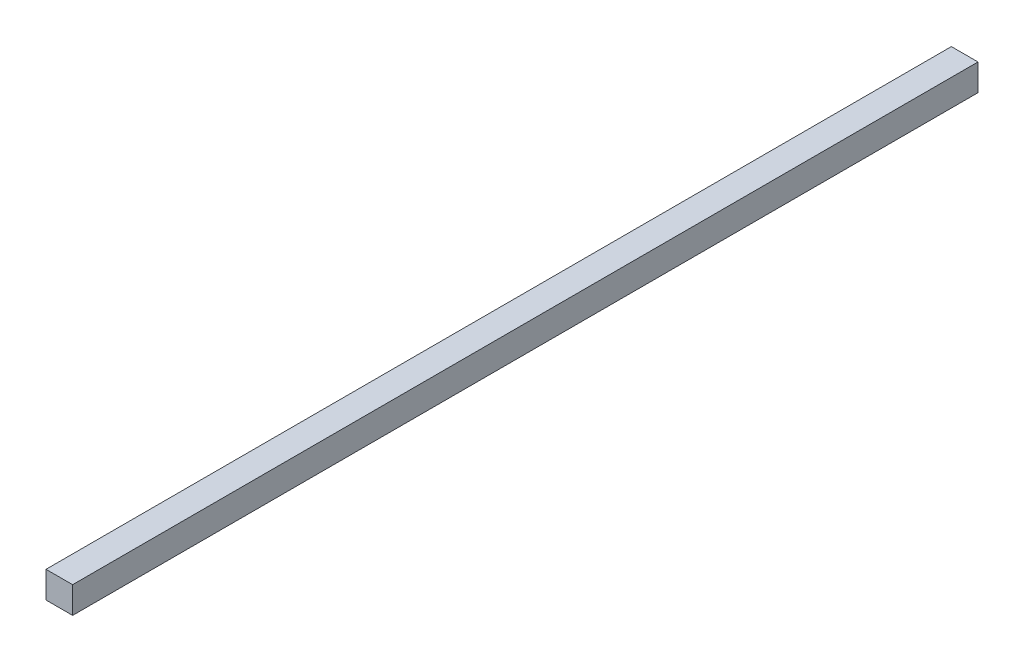
ISO-10303-21;
HEADER;
FILE_DESCRIPTION(('STEP AP214'),'2;1');
FILE_NAME('part.step','',(''),(''),'','','');
FILE_SCHEMA(('AUTOMOTIVE_DESIGN { 1 0 10303 214 1 1 1 1 }'));
ENDSEC;
DATA;
#1=APPLICATION_CONTEXT('core data for automotive mechanical design processes');
#2=APPLICATION_PROTOCOL_DEFINITION('international standard','automotive_design',2000,#1);
#3=PRODUCT_CONTEXT('',#1,'mechanical');
#4=PRODUCT('Part','Part','',(#3));
#5=PRODUCT_RELATED_PRODUCT_CATEGORY('part','',(#4));
#6=PRODUCT_DEFINITION_FORMATION('','',#4);
#7=PRODUCT_DEFINITION_CONTEXT('part definition',#1,'design');
#8=PRODUCT_DEFINITION('design','',#6,#7);
#9=PRODUCT_DEFINITION_SHAPE('','',#8);
#10=(LENGTH_UNIT() NAMED_UNIT(*) SI_UNIT(.MILLI.,.METRE.));
#11=(NAMED_UNIT(*) PLANE_ANGLE_UNIT() SI_UNIT($,.RADIAN.));
#12=(NAMED_UNIT(*) SI_UNIT($,.STERADIAN.) SOLID_ANGLE_UNIT());
#13=UNCERTAINTY_MEASURE_WITH_UNIT(LENGTH_MEASURE(1.E-05),#10,'distance_accuracy_value','');
#14=(GEOMETRIC_REPRESENTATION_CONTEXT(3) GLOBAL_UNCERTAINTY_ASSIGNED_CONTEXT((#13)) GLOBAL_UNIT_ASSIGNED_CONTEXT((#10,
#11,#12)) REPRESENTATION_CONTEXT('',''));
#15=CARTESIAN_POINT('',(0.,0.,0.));
#16=DIRECTION('',(0.,0.,1.));
#17=DIRECTION('',(1.,0.,0.));
#18=AXIS2_PLACEMENT_3D('',#15,#16,#17);
#19=CARTESIAN_POINT('',(-0.2499995,0.25000204,0.));
#20=DIRECTION('',(0.,1.,0.));
#21=DIRECTION('',(0.,0.,1.));
#22=AXIS2_PLACEMENT_3D('',#19,#20,#21);
#23=PLANE('',#22);
#24=DIRECTION('',(0.,0.,-1.));
#25=VECTOR('',#24,1.);
#26=CARTESIAN_POINT('',(0.25000204,0.25000204,0.));
#27=LINE('',#26,#25);
#28=CARTESIAN_POINT('',(0.25000204,0.25000204,0.));
#29=VERTEX_POINT('',#28);
#30=CARTESIAN_POINT('',(0.25000204,0.25000204,16.99999902));
#31=VERTEX_POINT('',#30);
#32=EDGE_CURVE('E62',#29,#31,#27,.F.);
#33=ORIENTED_EDGE('',*,*,#32,.F.);
#34=DIRECTION('',(1.,0.,0.));
#35=VECTOR('',#34,1.);
#36=CARTESIAN_POINT('',(-0.2499995,0.25000204,0.));
#37=LINE('',#36,#35);
#38=CARTESIAN_POINT('',(-0.2499995,0.25000204,0.));
#39=VERTEX_POINT('',#38);
#40=EDGE_CURVE('E20',#29,#39,#37,.F.);
#41=ORIENTED_EDGE('',*,*,#40,.T.);
#42=DIRECTION('',(0.,0.,1.));
#43=VECTOR('',#42,1.);
#44=CARTESIAN_POINT('',(-0.2499995,0.25000204,0.));
#45=LINE('',#44,#43);
#46=CARTESIAN_POINT('',(-0.2499995,0.25000204,16.99999902));
#47=VERTEX_POINT('',#46);
#48=EDGE_CURVE('E69',#47,#39,#45,.F.);
#49=ORIENTED_EDGE('',*,*,#48,.F.);
#50=DIRECTION('',(1.,0.,0.));
#51=VECTOR('',#50,1.);
#52=CARTESIAN_POINT('',(0.25000204,0.25000204,16.99999902));
#53=LINE('',#52,#51);
#54=EDGE_CURVE('E56',#31,#47,#53,.F.);
#55=ORIENTED_EDGE('',*,*,#54,.F.);
#56=EDGE_LOOP('',(#33,#41,#49,#55));
#57=FACE_BOUND('',#56,.T.);
#58=ADVANCED_FACE('F17',(#57),#23,.T.);
#59=CARTESIAN_POINT('',(0.25000204,0.25000204,0.));
#60=DIRECTION('',(1.,0.,0.));
#61=DIRECTION('',(0.,0.,-1.));
#62=AXIS2_PLACEMENT_3D('',#59,#60,#61);
#63=PLANE('',#62);
#64=DIRECTION('',(0.,0.,-1.));
#65=VECTOR('',#64,1.);
#66=CARTESIAN_POINT('',(0.25000204,-0.2499995,0.));
#67=LINE('',#66,#65);
#68=CARTESIAN_POINT('',(0.25000204,-0.2499995,0.));
#69=VERTEX_POINT('',#68);
#70=CARTESIAN_POINT('',(0.25000204,-0.2499995,16.99999902));
#71=VERTEX_POINT('',#70);
#72=EDGE_CURVE('E83',#69,#71,#67,.F.);
#73=ORIENTED_EDGE('',*,*,#72,.F.);
#74=DIRECTION('',(0.,1.,0.));
#75=VECTOR('',#74,1.);
#76=CARTESIAN_POINT('',(0.25000204,-0.2499995,0.));
#77=LINE('',#76,#75);
#78=EDGE_CURVE('E67',#69,#29,#77,.T.);
#79=ORIENTED_EDGE('',*,*,#78,.T.);
#80=ORIENTED_EDGE('',*,*,#32,.T.);
#81=DIRECTION('',(0.,1.,0.));
#82=VECTOR('',#81,1.);
#83=CARTESIAN_POINT('',(0.25000204,-0.2499995,16.99999902));
#84=LINE('',#83,#82);
#85=EDGE_CURVE('E64',#71,#31,#84,.T.);
#86=ORIENTED_EDGE('',*,*,#85,.F.);
#87=EDGE_LOOP('',(#73,#79,#80,#86));
#88=FACE_BOUND('',#87,.T.);
#89=ADVANCED_FACE('F63',(#88),#63,.T.);
#90=CARTESIAN_POINT('',(0.25000204,-0.2499995,16.99999902));
#91=DIRECTION('',(0.,0.,1.));
#92=DIRECTION('',(1.,0.,0.));
#93=AXIS2_PLACEMENT_3D('',#90,#91,#92);
#94=PLANE('',#93);
#95=DIRECTION('',(0.,1.,0.));
#96=VECTOR('',#95,1.);
#97=CARTESIAN_POINT('',(-0.2499995,-0.2499995,16.99999902));
#98=LINE('',#97,#96);
#99=CARTESIAN_POINT('',(-0.2499995,-0.2499995,16.99999902));
#100=VERTEX_POINT('',#99);
#101=EDGE_CURVE('E71',#100,#47,#98,.T.);
#102=ORIENTED_EDGE('',*,*,#101,.F.);
#103=DIRECTION('',(1.,0.,0.));
#104=VECTOR('',#103,1.);
#105=CARTESIAN_POINT('',(0.25000204,-0.2499995,16.99999902));
#106=LINE('',#105,#104);
#107=EDGE_CURVE('E75',#71,#100,#106,.F.);
#108=ORIENTED_EDGE('',*,*,#107,.F.);
#109=ORIENTED_EDGE('',*,*,#85,.T.);
#110=ORIENTED_EDGE('',*,*,#54,.T.);
#111=EDGE_LOOP('',(#102,#108,#109,#110));
#112=FACE_BOUND('',#111,.T.);
#113=ADVANCED_FACE('F73',(#112),#94,.T.);
#114=CARTESIAN_POINT('',(-0.2499995,-0.2499995,0.));
#115=DIRECTION('',(-1.,0.,0.));
#116=DIRECTION('',(0.,0.,1.));
#117=AXIS2_PLACEMENT_3D('',#114,#115,#116);
#118=PLANE('',#117);
#119=ORIENTED_EDGE('',*,*,#48,.T.);
#120=DIRECTION('',(0.,1.,0.));
#121=VECTOR('',#120,1.);
#122=CARTESIAN_POINT('',(-0.2499995,-0.2499995,0.));
#123=LINE('',#122,#121);
#124=CARTESIAN_POINT('',(-0.2499995,-0.2499995,0.));
#125=VERTEX_POINT('',#124);
#126=EDGE_CURVE('E35',#39,#125,#123,.F.);
#127=ORIENTED_EDGE('',*,*,#126,.T.);
#128=DIRECTION('',(0.,0.,-1.));
#129=VECTOR('',#128,1.);
#130=CARTESIAN_POINT('',(-0.2499995,-0.2499995,0.));
#131=LINE('',#130,#129);
#132=EDGE_CURVE('E26',#100,#125,#131,.T.);
#133=ORIENTED_EDGE('',*,*,#132,.F.);
#134=ORIENTED_EDGE('',*,*,#101,.T.);
#135=EDGE_LOOP('',(#119,#127,#133,#134));
#136=FACE_BOUND('',#135,.T.);
#137=ADVANCED_FACE('F89',(#136),#118,.T.);
#138=CARTESIAN_POINT('',(0.25000204,-0.2499995,0.));
#139=DIRECTION('',(0.,0.,1.));
#140=DIRECTION('',(1.,0.,0.));
#141=AXIS2_PLACEMENT_3D('',#138,#139,#140);
#142=PLANE('',#141);
#143=ORIENTED_EDGE('',*,*,#126,.F.);
#144=ORIENTED_EDGE('',*,*,#40,.F.);
#145=ORIENTED_EDGE('',*,*,#78,.F.);
#146=DIRECTION('',(1.,0.,0.));
#147=VECTOR('',#146,1.);
#148=CARTESIAN_POINT('',(0.25000204,-0.2499995,0.));
#149=LINE('',#148,#147);
#150=EDGE_CURVE('E11',#125,#69,#149,.T.);
#151=ORIENTED_EDGE('',*,*,#150,.F.);
#152=EDGE_LOOP('',(#143,#144,#145,#151));
#153=FACE_BOUND('',#152,.T.);
#154=ADVANCED_FACE('F91',(#153),#142,.F.);
#155=CARTESIAN_POINT('',(0.25000204,-0.2499995,0.));
#156=DIRECTION('',(0.,-1.,0.));
#157=DIRECTION('',(0.,0.,-1.));
#158=AXIS2_PLACEMENT_3D('',#155,#156,#157);
#159=PLANE('',#158);
#160=ORIENTED_EDGE('',*,*,#132,.T.);
#161=ORIENTED_EDGE('',*,*,#150,.T.);
#162=ORIENTED_EDGE('',*,*,#72,.T.);
#163=ORIENTED_EDGE('',*,*,#107,.T.);
#164=EDGE_LOOP('',(#160,#161,#162,#163));
#165=FACE_BOUND('',#164,.T.);
#166=ADVANCED_FACE('F88',(#165),#159,.T.);
#167=CLOSED_SHELL('',(#58,#89,#113,#137,#154,#166));
#168=MANIFOLD_SOLID_BREP('B1',#167);
#169=ADVANCED_BREP_SHAPE_REPRESENTATION('',(#18,#168),#14);
#170=SHAPE_DEFINITION_REPRESENTATION(#9,#169);
ENDSEC;
END-ISO-10303-21;
